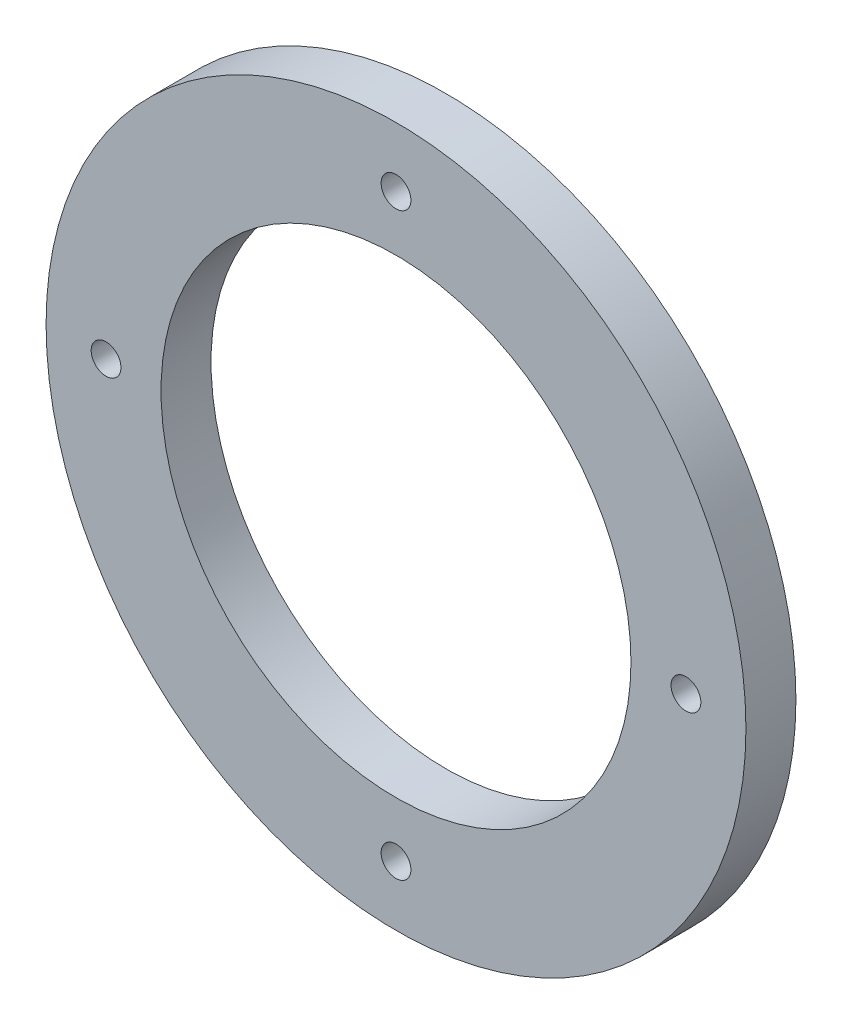
ISO-10303-21;
HEADER;
FILE_DESCRIPTION(('STEP AP214'),'2;1');
FILE_NAME('part.step','',(''),(''),'','','');
FILE_SCHEMA(('AUTOMOTIVE_DESIGN { 1 0 10303 214 1 1 1 1 }'));
ENDSEC;
DATA;
#1=APPLICATION_CONTEXT('core data for automotive mechanical design processes');
#2=APPLICATION_PROTOCOL_DEFINITION('international standard','automotive_design',2000,#1);
#3=PRODUCT_CONTEXT('',#1,'mechanical');
#4=PRODUCT('Part','Part','',(#3));
#5=PRODUCT_RELATED_PRODUCT_CATEGORY('part','',(#4));
#6=PRODUCT_DEFINITION_FORMATION('','',#4);
#7=PRODUCT_DEFINITION_CONTEXT('part definition',#1,'design');
#8=PRODUCT_DEFINITION('design','',#6,#7);
#9=PRODUCT_DEFINITION_SHAPE('','',#8);
#10=(LENGTH_UNIT() NAMED_UNIT(*) SI_UNIT(.MILLI.,.METRE.));
#11=(NAMED_UNIT(*) PLANE_ANGLE_UNIT() SI_UNIT($,.RADIAN.));
#12=(NAMED_UNIT(*) SI_UNIT($,.STERADIAN.) SOLID_ANGLE_UNIT());
#13=UNCERTAINTY_MEASURE_WITH_UNIT(LENGTH_MEASURE(1.E-05),#10,'distance_accuracy_value','');
#14=(GEOMETRIC_REPRESENTATION_CONTEXT(3) GLOBAL_UNCERTAINTY_ASSIGNED_CONTEXT((#13)) GLOBAL_UNIT_ASSIGNED_CONTEXT((#10,
#11,#12)) REPRESENTATION_CONTEXT('',''));
#15=CARTESIAN_POINT('',(0.,0.,0.));
#16=DIRECTION('',(0.,0.,1.));
#17=DIRECTION('',(1.,0.,0.));
#18=AXIS2_PLACEMENT_3D('',#15,#16,#17);
#19=CARTESIAN_POINT('',(0.,0.,5.));
#20=DIRECTION('',(0.,0.,1.));
#21=DIRECTION('',(1.,0.,0.));
#22=AXIS2_PLACEMENT_3D('',#19,#20,#21);
#23=PLANE('',#22);
#24=CARTESIAN_POINT('',(-29.,0.,5.));
#25=DIRECTION('',(0.,0.,1.));
#26=DIRECTION('',(1.,0.,0.));
#27=AXIS2_PLACEMENT_3D('',#24,#25,#26);
#28=CIRCLE('',#27,1.49);
#29=CARTESIAN_POINT('',(-27.51,0.,5.));
#30=VERTEX_POINT('',#29);
#31=EDGE_CURVE('E59',#30,#30,#28,.T.);
#32=ORIENTED_EDGE('',*,*,#31,.F.);
#33=EDGE_LOOP('',(#32));
#34=FACE_BOUND('',#33,.T.);
#35=CARTESIAN_POINT('',(29.,0.,5.));
#36=DIRECTION('',(0.,0.,1.));
#37=DIRECTION('',(1.,0.,0.));
#38=AXIS2_PLACEMENT_3D('',#35,#36,#37);
#39=CIRCLE('',#38,1.49);
#40=CARTESIAN_POINT('',(30.49,0.,5.));
#41=VERTEX_POINT('',#40);
#42=EDGE_CURVE('E47',#41,#41,#39,.T.);
#43=ORIENTED_EDGE('',*,*,#42,.F.);
#44=EDGE_LOOP('',(#43));
#45=FACE_BOUND('',#44,.T.);
#46=CARTESIAN_POINT('',(0.,0.,5.));
#47=DIRECTION('',(0.,0.,1.));
#48=DIRECTION('',(1.,0.,0.));
#49=AXIS2_PLACEMENT_3D('',#46,#47,#48);
#50=CIRCLE('',#49,35.);
#51=CARTESIAN_POINT('',(35.,0.,5.));
#52=VERTEX_POINT('',#51);
#53=EDGE_CURVE('E10',#52,#52,#50,.T.);
#54=ORIENTED_EDGE('',*,*,#53,.T.);
#55=EDGE_LOOP('',(#54));
#56=FACE_BOUND('',#55,.T.);
#57=CARTESIAN_POINT('',(0.,0.,5.));
#58=DIRECTION('',(0.,0.,1.));
#59=DIRECTION('',(1.,0.,0.));
#60=AXIS2_PLACEMENT_3D('',#57,#58,#59);
#61=CIRCLE('',#60,23.5);
#62=CARTESIAN_POINT('',(23.5,0.,5.));
#63=VERTEX_POINT('',#62);
#64=EDGE_CURVE('E42',#63,#63,#61,.T.);
#65=ORIENTED_EDGE('',*,*,#64,.F.);
#66=EDGE_LOOP('',(#65));
#67=FACE_BOUND('',#66,.T.);
#68=CARTESIAN_POINT('',(0.,29.,5.));
#69=DIRECTION('',(0.,0.,1.));
#70=DIRECTION('',(1.,0.,0.));
#71=AXIS2_PLACEMENT_3D('',#68,#69,#70);
#72=CIRCLE('',#71,1.49);
#73=CARTESIAN_POINT('',(1.49,29.,5.));
#74=VERTEX_POINT('',#73);
#75=EDGE_CURVE('E53',#74,#74,#72,.T.);
#76=ORIENTED_EDGE('',*,*,#75,.F.);
#77=EDGE_LOOP('',(#76));
#78=FACE_BOUND('',#77,.T.);
#79=CARTESIAN_POINT('',(0.,-29.,5.));
#80=DIRECTION('',(0.,0.,1.));
#81=DIRECTION('',(1.,0.,0.));
#82=AXIS2_PLACEMENT_3D('',#79,#80,#81);
#83=CIRCLE('',#82,1.49);
#84=CARTESIAN_POINT('',(1.49,-29.,5.));
#85=VERTEX_POINT('',#84);
#86=EDGE_CURVE('E65',#85,#85,#83,.T.);
#87=ORIENTED_EDGE('',*,*,#86,.F.);
#88=EDGE_LOOP('',(#87));
#89=FACE_BOUND('',#88,.T.);
#90=ADVANCED_FACE('F31',(#34,#45,#56,#67,#78,#89),#23,.T.);
#91=CARTESIAN_POINT('',(0.,0.,0.));
#92=DIRECTION('',(0.,0.,1.));
#93=DIRECTION('',(1.,0.,0.));
#94=AXIS2_PLACEMENT_3D('',#91,#92,#93);
#95=PLANE('',#94);
#96=CARTESIAN_POINT('',(0.,0.,0.));
#97=DIRECTION('',(0.,0.,1.));
#98=DIRECTION('',(1.,0.,0.));
#99=AXIS2_PLACEMENT_3D('',#96,#97,#98);
#100=CIRCLE('',#99,35.);
#101=CARTESIAN_POINT('',(35.,0.,0.));
#102=VERTEX_POINT('',#101);
#103=EDGE_CURVE('E35',#102,#102,#100,.T.);
#104=ORIENTED_EDGE('',*,*,#103,.F.);
#105=EDGE_LOOP('',(#104));
#106=FACE_BOUND('',#105,.T.);
#107=CARTESIAN_POINT('',(0.,0.,0.));
#108=DIRECTION('',(0.,0.,1.));
#109=DIRECTION('',(1.,0.,0.));
#110=AXIS2_PLACEMENT_3D('',#107,#108,#109);
#111=CIRCLE('',#110,23.5);
#112=CARTESIAN_POINT('',(23.5,0.,0.));
#113=VERTEX_POINT('',#112);
#114=EDGE_CURVE('E44',#113,#113,#111,.T.);
#115=ORIENTED_EDGE('',*,*,#114,.T.);
#116=EDGE_LOOP('',(#115));
#117=FACE_BOUND('',#116,.T.);
#118=CARTESIAN_POINT('',(29.,0.,0.));
#119=DIRECTION('',(0.,0.,1.));
#120=DIRECTION('',(1.,0.,0.));
#121=AXIS2_PLACEMENT_3D('',#118,#119,#120);
#122=CIRCLE('',#121,1.49);
#123=CARTESIAN_POINT('',(30.49,0.,0.));
#124=VERTEX_POINT('',#123);
#125=EDGE_CURVE('E50',#124,#124,#122,.T.);
#126=ORIENTED_EDGE('',*,*,#125,.T.);
#127=EDGE_LOOP('',(#126));
#128=FACE_BOUND('',#127,.T.);
#129=CARTESIAN_POINT('',(0.,29.,0.));
#130=DIRECTION('',(0.,0.,1.));
#131=DIRECTION('',(1.,0.,0.));
#132=AXIS2_PLACEMENT_3D('',#129,#130,#131);
#133=CIRCLE('',#132,1.49);
#134=CARTESIAN_POINT('',(1.49,29.,0.));
#135=VERTEX_POINT('',#134);
#136=EDGE_CURVE('E56',#135,#135,#133,.T.);
#137=ORIENTED_EDGE('',*,*,#136,.T.);
#138=EDGE_LOOP('',(#137));
#139=FACE_BOUND('',#138,.T.);
#140=CARTESIAN_POINT('',(-29.,0.,0.));
#141=DIRECTION('',(0.,0.,1.));
#142=DIRECTION('',(1.,0.,0.));
#143=AXIS2_PLACEMENT_3D('',#140,#141,#142);
#144=CIRCLE('',#143,1.49);
#145=CARTESIAN_POINT('',(-27.51,0.,0.));
#146=VERTEX_POINT('',#145);
#147=EDGE_CURVE('E62',#146,#146,#144,.T.);
#148=ORIENTED_EDGE('',*,*,#147,.T.);
#149=EDGE_LOOP('',(#148));
#150=FACE_BOUND('',#149,.T.);
#151=CARTESIAN_POINT('',(0.,-29.,0.));
#152=DIRECTION('',(0.,0.,1.));
#153=DIRECTION('',(1.,0.,0.));
#154=AXIS2_PLACEMENT_3D('',#151,#152,#153);
#155=CIRCLE('',#154,1.49);
#156=CARTESIAN_POINT('',(1.49,-29.,0.));
#157=VERTEX_POINT('',#156);
#158=EDGE_CURVE('E68',#157,#157,#155,.T.);
#159=ORIENTED_EDGE('',*,*,#158,.T.);
#160=EDGE_LOOP('',(#159));
#161=FACE_BOUND('',#160,.T.);
#162=ADVANCED_FACE('F78',(#106,#117,#128,#139,#150,#161),#95,.F.);
#163=CARTESIAN_POINT('',(0.,0.,5.));
#164=DIRECTION('',(0.,0.,-1.));
#165=DIRECTION('',(-1.,0.,0.));
#166=AXIS2_PLACEMENT_3D('',#163,#164,#165);
#167=CYLINDRICAL_SURFACE('',#166,35.);
#168=ORIENTED_EDGE('',*,*,#53,.F.);
#169=EDGE_LOOP('',(#168));
#170=FACE_BOUND('',#169,.T.);
#171=ORIENTED_EDGE('',*,*,#103,.T.);
#172=EDGE_LOOP('',(#171));
#173=FACE_BOUND('',#172,.T.);
#174=ADVANCED_FACE('F33',(#170,#173),#167,.T.);
#175=CARTESIAN_POINT('',(0.,0.,5.));
#176=DIRECTION('',(0.,0.,-1.));
#177=DIRECTION('',(-1.,0.,0.));
#178=AXIS2_PLACEMENT_3D('',#175,#176,#177);
#179=CYLINDRICAL_SURFACE('',#178,23.5);
#180=ORIENTED_EDGE('',*,*,#64,.T.);
#181=EDGE_LOOP('',(#180));
#182=FACE_BOUND('',#181,.T.);
#183=ORIENTED_EDGE('',*,*,#114,.F.);
#184=EDGE_LOOP('',(#183));
#185=FACE_BOUND('',#184,.T.);
#186=ADVANCED_FACE('F88',(#182,#185),#179,.F.);
#187=CARTESIAN_POINT('',(29.,0.,5.));
#188=DIRECTION('',(0.,0.,-1.));
#189=DIRECTION('',(-1.,0.,0.));
#190=AXIS2_PLACEMENT_3D('',#187,#188,#189);
#191=CYLINDRICAL_SURFACE('',#190,1.49);
#192=ORIENTED_EDGE('',*,*,#42,.T.);
#193=EDGE_LOOP('',(#192));
#194=FACE_BOUND('',#193,.T.);
#195=ORIENTED_EDGE('',*,*,#125,.F.);
#196=EDGE_LOOP('',(#195));
#197=FACE_BOUND('',#196,.T.);
#198=ADVANCED_FACE('F91',(#194,#197),#191,.F.);
#199=CARTESIAN_POINT('',(0.,29.,5.));
#200=DIRECTION('',(0.,0.,-1.));
#201=DIRECTION('',(-1.,0.,0.));
#202=AXIS2_PLACEMENT_3D('',#199,#200,#201);
#203=CYLINDRICAL_SURFACE('',#202,1.49);
#204=ORIENTED_EDGE('',*,*,#75,.T.);
#205=EDGE_LOOP('',(#204));
#206=FACE_BOUND('',#205,.T.);
#207=ORIENTED_EDGE('',*,*,#136,.F.);
#208=EDGE_LOOP('',(#207));
#209=FACE_BOUND('',#208,.T.);
#210=ADVANCED_FACE('F95',(#206,#209),#203,.F.);
#211=CARTESIAN_POINT('',(-29.,0.,5.));
#212=DIRECTION('',(0.,0.,-1.));
#213=DIRECTION('',(-1.,0.,0.));
#214=AXIS2_PLACEMENT_3D('',#211,#212,#213);
#215=CYLINDRICAL_SURFACE('',#214,1.49);
#216=ORIENTED_EDGE('',*,*,#31,.T.);
#217=EDGE_LOOP('',(#216));
#218=FACE_BOUND('',#217,.T.);
#219=ORIENTED_EDGE('',*,*,#147,.F.);
#220=EDGE_LOOP('',(#219));
#221=FACE_BOUND('',#220,.T.);
#222=ADVANCED_FACE('F99',(#218,#221),#215,.F.);
#223=CARTESIAN_POINT('',(0.,-29.,5.));
#224=DIRECTION('',(0.,0.,-1.));
#225=DIRECTION('',(-1.,0.,0.));
#226=AXIS2_PLACEMENT_3D('',#223,#224,#225);
#227=CYLINDRICAL_SURFACE('',#226,1.49);
#228=ORIENTED_EDGE('',*,*,#86,.T.);
#229=EDGE_LOOP('',(#228));
#230=FACE_BOUND('',#229,.T.);
#231=ORIENTED_EDGE('',*,*,#158,.F.);
#232=EDGE_LOOP('',(#231));
#233=FACE_BOUND('',#232,.T.);
#234=ADVANCED_FACE('F74',(#230,#233),#227,.F.);
#235=CLOSED_SHELL('',(#90,#162,#174,#186,#198,#210,#222,#234));
#236=MANIFOLD_SOLID_BREP('B2',#235);
#237=ADVANCED_BREP_SHAPE_REPRESENTATION('',(#18,#236),#14);
#238=SHAPE_DEFINITION_REPRESENTATION(#9,#237);
ENDSEC;
END-ISO-10303-21;
